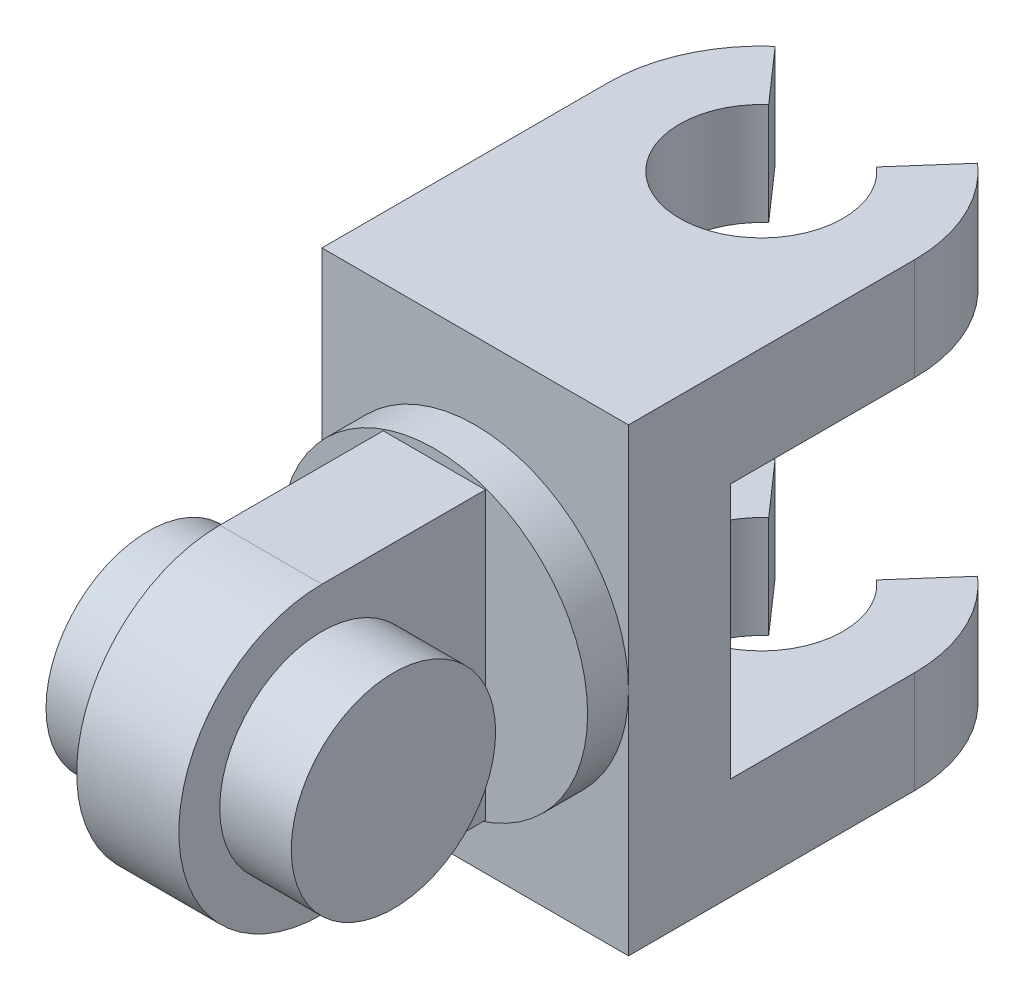
ISO-10303-21;
HEADER;
FILE_DESCRIPTION(('STEP AP214'),'2;1');
FILE_NAME('part.step','',(''),(''),'','','');
FILE_SCHEMA(('AUTOMOTIVE_DESIGN { 1 0 10303 214 1 1 1 1 }'));
ENDSEC;
DATA;
#1=APPLICATION_CONTEXT('core data for automotive mechanical design processes');
#2=APPLICATION_PROTOCOL_DEFINITION('international standard','automotive_design',2000,#1);
#3=PRODUCT_CONTEXT('',#1,'mechanical');
#4=PRODUCT('Part','Part','',(#3));
#5=PRODUCT_RELATED_PRODUCT_CATEGORY('part','',(#4));
#6=PRODUCT_DEFINITION_FORMATION('','',#4);
#7=PRODUCT_DEFINITION_CONTEXT('part definition',#1,'design');
#8=PRODUCT_DEFINITION('design','',#6,#7);
#9=PRODUCT_DEFINITION_SHAPE('','',#8);
#10=(LENGTH_UNIT() NAMED_UNIT(*) SI_UNIT(.MILLI.,.METRE.));
#11=(NAMED_UNIT(*) PLANE_ANGLE_UNIT() SI_UNIT($,.RADIAN.));
#12=(NAMED_UNIT(*) SI_UNIT($,.STERADIAN.) SOLID_ANGLE_UNIT());
#13=UNCERTAINTY_MEASURE_WITH_UNIT(LENGTH_MEASURE(1.E-05),#10,'distance_accuracy_value','');
#14=(GEOMETRIC_REPRESENTATION_CONTEXT(3) GLOBAL_UNCERTAINTY_ASSIGNED_CONTEXT((#13)) GLOBAL_UNIT_ASSIGNED_CONTEXT((#10,
#11,#12)) REPRESENTATION_CONTEXT('',''));
#15=CARTESIAN_POINT('',(0.,0.,0.));
#16=DIRECTION('',(0.,0.,1.));
#17=DIRECTION('',(1.,0.,0.));
#18=AXIS2_PLACEMENT_3D('',#15,#16,#17);
#19=CARTESIAN_POINT('',(0.,22.5,-48.));
#20=DIRECTION('',(0.,-1.,0.));
#21=DIRECTION('',(0.,0.,-1.));
#22=AXIS2_PLACEMENT_3D('',#19,#20,#21);
#23=CYLINDRICAL_SURFACE('',#22,15.);
#24=CARTESIAN_POINT('',(0.,12.5,-48.));
#25=DIRECTION('',(0.,1.,0.));
#26=DIRECTION('',(0.,0.,-1.));
#27=AXIS2_PLACEMENT_3D('',#24,#25,#26);
#28=CIRCLE('',#27,15.);
#29=CARTESIAN_POINT('',(15.,12.5,-48.));
#30=VERTEX_POINT('',#29);
#31=CARTESIAN_POINT('',(9.90919275071647,12.5,-59.2609013417731));
#32=VERTEX_POINT('',#31);
#33=EDGE_CURVE('E211',#30,#32,#28,.T.);
#34=ORIENTED_EDGE('',*,*,#33,.T.);
#35=DIRECTION('',(0.,1.,0.));
#36=VECTOR('',#35,1.);
#37=CARTESIAN_POINT('',(9.90919275071647,-44.2638182496902,-59.2609013417731));
#38=LINE('',#37,#36);
#39=CARTESIAN_POINT('',(9.90919275071647,22.5,-59.2609013417731));
#40=VERTEX_POINT('',#39);
#41=EDGE_CURVE('E402',#32,#40,#38,.T.);
#42=ORIENTED_EDGE('',*,*,#41,.T.);
#43=CARTESIAN_POINT('',(0.,22.5,-48.));
#44=DIRECTION('',(0.,1.,0.));
#45=DIRECTION('',(0.,0.,-1.));
#46=AXIS2_PLACEMENT_3D('',#43,#44,#45);
#47=CIRCLE('',#46,15.);
#48=CARTESIAN_POINT('',(15.,22.5,-48.));
#49=VERTEX_POINT('',#48);
#50=EDGE_CURVE('E207',#49,#40,#47,.T.);
#51=ORIENTED_EDGE('',*,*,#50,.F.);
#52=DIRECTION('',(0.,-1.,0.));
#53=VECTOR('',#52,1.);
#54=CARTESIAN_POINT('',(15.,22.5,-48.));
#55=LINE('',#54,#53);
#56=EDGE_CURVE('E226',#49,#30,#55,.T.);
#57=ORIENTED_EDGE('',*,*,#56,.T.);
#58=EDGE_LOOP('',(#34,#42,#51,#57));
#59=FACE_BOUND('',#58,.T.);
#60=ADVANCED_FACE('F41',(#59),#23,.T.);
#61=CARTESIAN_POINT('',(0.,-22.5,-48.));
#62=DIRECTION('',(0.,1.,0.));
#63=DIRECTION('',(0.,0.,1.));
#64=AXIS2_PLACEMENT_3D('',#61,#62,#63);
#65=CYLINDRICAL_SURFACE('',#64,15.);
#66=CARTESIAN_POINT('',(9.90919275071648,-22.5,-59.2609013417731));
#67=VERTEX_POINT('',#66);
#68=CARTESIAN_POINT('',(9.90919275071647,-12.5,-59.2609013417731));
#69=VERTEX_POINT('',#68);
#70=EDGE_CURVE('E393',#67,#69,#38,.T.);
#71=ORIENTED_EDGE('',*,*,#70,.T.);
#72=CARTESIAN_POINT('',(0.,-12.5,-48.));
#73=DIRECTION('',(0.,1.,0.));
#74=DIRECTION('',(0.,0.,-1.));
#75=AXIS2_PLACEMENT_3D('',#72,#73,#74);
#76=CIRCLE('',#75,15.);
#77=CARTESIAN_POINT('',(15.,-12.5,-48.));
#78=VERTEX_POINT('',#77);
#79=EDGE_CURVE('E430',#78,#69,#76,.T.);
#80=ORIENTED_EDGE('',*,*,#79,.F.);
#81=DIRECTION('',(0.,1.,0.));
#82=VECTOR('',#81,1.);
#83=CARTESIAN_POINT('',(15.,-22.5,-48.));
#84=LINE('',#83,#82);
#85=CARTESIAN_POINT('',(15.,-22.5,-48.));
#86=VERTEX_POINT('',#85);
#87=EDGE_CURVE('E413',#86,#78,#84,.T.);
#88=ORIENTED_EDGE('',*,*,#87,.F.);
#89=CARTESIAN_POINT('',(0.,-22.5,-48.));
#90=DIRECTION('',(0.,1.,0.));
#91=DIRECTION('',(0.,0.,-1.));
#92=AXIS2_PLACEMENT_3D('',#89,#90,#91);
#93=CIRCLE('',#92,15.);
#94=EDGE_CURVE('E406',#86,#67,#93,.T.);
#95=ORIENTED_EDGE('',*,*,#94,.T.);
#96=EDGE_LOOP('',(#71,#80,#88,#95));
#97=FACE_BOUND('',#96,.T.);
#98=ADVANCED_FACE('F337',(#97),#65,.T.);
#99=CARTESIAN_POINT('',(0.,0.,-30.));
#100=DIRECTION('',(0.,0.,-1.));
#101=DIRECTION('',(-1.,0.,0.));
#102=AXIS2_PLACEMENT_3D('',#99,#100,#101);
#103=PLANE('',#102);
#104=DIRECTION('',(0.,-1.,0.));
#105=VECTOR('',#104,1.);
#106=CARTESIAN_POINT('',(15.,22.5,-30.));
#107=LINE('',#106,#105);
#108=CARTESIAN_POINT('',(15.,12.5,-30.));
#109=VERTEX_POINT('',#108);
#110=CARTESIAN_POINT('',(15.,-12.5,-30.));
#111=VERTEX_POINT('',#110);
#112=EDGE_CURVE('E232',#109,#111,#107,.T.);
#113=ORIENTED_EDGE('',*,*,#112,.T.);
#114=DIRECTION('',(1.,0.,0.));
#115=VECTOR('',#114,1.);
#116=CARTESIAN_POINT('',(15.,-12.5,-30.));
#117=LINE('',#116,#115);
#118=CARTESIAN_POINT('',(-15.,-12.5,-30.));
#119=VERTEX_POINT('',#118);
#120=EDGE_CURVE('E423',#119,#111,#117,.T.);
#121=ORIENTED_EDGE('',*,*,#120,.F.);
#122=DIRECTION('',(0.,1.,0.));
#123=VECTOR('',#122,1.);
#124=CARTESIAN_POINT('',(-15.,22.5,-30.));
#125=LINE('',#124,#123);
#126=CARTESIAN_POINT('',(-15.,12.5,-30.));
#127=VERTEX_POINT('',#126);
#128=EDGE_CURVE('E230',#119,#127,#125,.T.);
#129=ORIENTED_EDGE('',*,*,#128,.T.);
#130=DIRECTION('',(1.,0.,0.));
#131=VECTOR('',#130,1.);
#132=CARTESIAN_POINT('',(15.,12.5,-30.));
#133=LINE('',#132,#131);
#134=EDGE_CURVE('E217',#127,#109,#133,.T.);
#135=ORIENTED_EDGE('',*,*,#134,.T.);
#136=EDGE_LOOP('',(#113,#121,#129,#135));
#137=FACE_BOUND('',#136,.T.);
#138=ADVANCED_FACE('F344',(#137),#103,.T.);
#139=CARTESIAN_POINT('',(12.,0.,0.));
#140=DIRECTION('',(-1.,0.,0.));
#141=DIRECTION('',(0.,0.,1.));
#142=AXIS2_PLACEMENT_3D('',#139,#140,#141);
#143=CYLINDRICAL_SURFACE('',#142,10.);
#144=CARTESIAN_POINT('',(12.,0.,0.));
#145=DIRECTION('',(1.,0.,0.));
#146=DIRECTION('',(0.,0.,-1.));
#147=AXIS2_PLACEMENT_3D('',#144,#145,#146);
#148=CIRCLE('',#147,10.);
#149=CARTESIAN_POINT('',(12.,0.,-10.));
#150=VERTEX_POINT('',#149);
#151=EDGE_CURVE('E49',#150,#150,#148,.T.);
#152=ORIENTED_EDGE('',*,*,#151,.F.);
#153=EDGE_LOOP('',(#152));
#154=FACE_BOUND('',#153,.T.);
#155=CARTESIAN_POINT('',(5.,0.,0.));
#156=DIRECTION('',(-1.,0.,0.));
#157=DIRECTION('',(0.,0.,1.));
#158=AXIS2_PLACEMENT_3D('',#155,#156,#157);
#159=CIRCLE('',#158,10.);
#160=CARTESIAN_POINT('',(5.,0.,10.));
#161=VERTEX_POINT('',#160);
#162=EDGE_CURVE('E11',#161,#161,#159,.T.);
#163=ORIENTED_EDGE('',*,*,#162,.F.);
#164=EDGE_LOOP('',(#163));
#165=FACE_BOUND('',#164,.T.);
#166=ADVANCED_FACE('F495',(#154,#165),#143,.T.);
#167=CARTESIAN_POINT('',(12.,0.,0.));
#168=DIRECTION('',(1.,0.,0.));
#169=DIRECTION('',(0.,0.,-1.));
#170=AXIS2_PLACEMENT_3D('',#167,#168,#169);
#171=PLANE('',#170);
#172=ORIENTED_EDGE('',*,*,#151,.T.);
#173=EDGE_LOOP('',(#172));
#174=FACE_BOUND('',#173,.T.);
#175=ADVANCED_FACE('F508',(#174),#171,.T.);
#176=CARTESIAN_POINT('',(5.,0.,0.));
#177=DIRECTION('',(-1.,0.,0.));
#178=DIRECTION('',(0.,0.,1.));
#179=AXIS2_PLACEMENT_3D('',#176,#177,#178);
#180=CYLINDRICAL_SURFACE('',#179,14.);
#181=CARTESIAN_POINT('',(-5.,0.,0.));
#182=DIRECTION('',(1.,0.,0.));
#183=DIRECTION('',(0.,0.,1.));
#184=AXIS2_PLACEMENT_3D('',#181,#182,#183);
#185=CIRCLE('',#184,14.);
#186=CARTESIAN_POINT('',(-5.,14.,0.));
#187=VERTEX_POINT('',#186);
#188=CARTESIAN_POINT('',(-5.,-14.,0.));
#189=VERTEX_POINT('',#188);
#190=EDGE_CURVE('E260',#187,#189,#185,.T.);
#191=ORIENTED_EDGE('',*,*,#190,.T.);
#192=DIRECTION('',(-1.,0.,0.));
#193=VECTOR('',#192,1.);
#194=CARTESIAN_POINT('',(5.,-14.,0.));
#195=LINE('',#194,#193);
#196=CARTESIAN_POINT('',(5.,-14.,0.));
#197=VERTEX_POINT('',#196);
#198=EDGE_CURVE('E291',#197,#189,#195,.T.);
#199=ORIENTED_EDGE('',*,*,#198,.F.);
#200=CARTESIAN_POINT('',(5.,0.,0.));
#201=DIRECTION('',(1.,0.,0.));
#202=DIRECTION('',(0.,0.,1.));
#203=AXIS2_PLACEMENT_3D('',#200,#201,#202);
#204=CIRCLE('',#203,14.);
#205=CARTESIAN_POINT('',(5.,14.,0.));
#206=VERTEX_POINT('',#205);
#207=EDGE_CURVE('E264',#206,#197,#204,.T.);
#208=ORIENTED_EDGE('',*,*,#207,.F.);
#209=DIRECTION('',(-1.,0.,0.));
#210=VECTOR('',#209,1.);
#211=CARTESIAN_POINT('',(5.,14.,0.));
#212=LINE('',#211,#210);
#213=EDGE_CURVE('E274',#206,#187,#212,.T.);
#214=ORIENTED_EDGE('',*,*,#213,.T.);
#215=EDGE_LOOP('',(#191,#199,#208,#214));
#216=FACE_BOUND('',#215,.T.);
#217=ADVANCED_FACE('F314',(#216),#180,.T.);
#218=CARTESIAN_POINT('',(5.,-14.,-16.));
#219=DIRECTION('',(0.,1.,0.));
#220=DIRECTION('',(0.,0.,1.));
#221=AXIS2_PLACEMENT_3D('',#218,#219,#220);
#222=PLANE('',#221);
#223=DIRECTION('',(0.,0.,-1.));
#224=VECTOR('',#223,1.);
#225=CARTESIAN_POINT('',(-5.,-14.,-16.));
#226=LINE('',#225,#224);
#227=CARTESIAN_POINT('',(-5.,-14.,-16.));
#228=VERTEX_POINT('',#227);
#229=EDGE_CURVE('E277',#189,#228,#226,.T.);
#230=ORIENTED_EDGE('',*,*,#229,.T.);
#231=DIRECTION('',(-1.,0.,0.));
#232=VECTOR('',#231,1.);
#233=CARTESIAN_POINT('',(5.,-14.,-16.));
#234=LINE('',#233,#232);
#235=CARTESIAN_POINT('',(5.,-14.,-16.));
#236=VERTEX_POINT('',#235);
#237=EDGE_CURVE('E288',#236,#228,#234,.T.);
#238=ORIENTED_EDGE('',*,*,#237,.F.);
#239=DIRECTION('',(0.,0.,-1.));
#240=VECTOR('',#239,1.);
#241=CARTESIAN_POINT('',(5.,-14.,-16.));
#242=LINE('',#241,#240);
#243=EDGE_CURVE('E267',#197,#236,#242,.T.);
#244=ORIENTED_EDGE('',*,*,#243,.F.);
#245=ORIENTED_EDGE('',*,*,#198,.T.);
#246=EDGE_LOOP('',(#230,#238,#244,#245));
#247=FACE_BOUND('',#246,.T.);
#248=ADVANCED_FACE('F326',(#247),#222,.F.);
#249=CARTESIAN_POINT('',(5.,14.,0.));
#250=DIRECTION('',(0.,-1.,0.));
#251=DIRECTION('',(0.,0.,-1.));
#252=AXIS2_PLACEMENT_3D('',#249,#250,#251);
#253=PLANE('',#252);
#254=DIRECTION('',(0.,0.,1.));
#255=VECTOR('',#254,1.);
#256=CARTESIAN_POINT('',(-5.,14.,0.));
#257=LINE('',#256,#255);
#258=CARTESIAN_POINT('',(-5.,14.,-16.));
#259=VERTEX_POINT('',#258);
#260=EDGE_CURVE('E268',#259,#187,#257,.T.);
#261=ORIENTED_EDGE('',*,*,#260,.T.);
#262=ORIENTED_EDGE('',*,*,#213,.F.);
#263=DIRECTION('',(0.,0.,1.));
#264=VECTOR('',#263,1.);
#265=CARTESIAN_POINT('',(5.,14.,0.));
#266=LINE('',#265,#264);
#267=CARTESIAN_POINT('',(5.,14.,-16.));
#268=VERTEX_POINT('',#267);
#269=EDGE_CURVE('E272',#268,#206,#266,.T.);
#270=ORIENTED_EDGE('',*,*,#269,.F.);
#271=DIRECTION('',(-1.,0.,0.));
#272=VECTOR('',#271,1.);
#273=CARTESIAN_POINT('',(5.,14.,-16.));
#274=LINE('',#273,#272);
#275=EDGE_CURVE('E286',#268,#259,#274,.T.);
#276=ORIENTED_EDGE('',*,*,#275,.T.);
#277=EDGE_LOOP('',(#261,#262,#270,#276));
#278=FACE_BOUND('',#277,.T.);
#279=ADVANCED_FACE('F319',(#278),#253,.F.);
#280=CARTESIAN_POINT('',(5.,0.,0.));
#281=DIRECTION('',(-1.,0.,0.));
#282=DIRECTION('',(0.,0.,1.));
#283=AXIS2_PLACEMENT_3D('',#280,#281,#282);
#284=PLANE('',#283);
#285=ORIENTED_EDGE('',*,*,#162,.T.);
#286=EDGE_LOOP('',(#285));
#287=FACE_BOUND('',#286,.T.);
#288=ORIENTED_EDGE('',*,*,#207,.T.);
#289=ORIENTED_EDGE('',*,*,#243,.T.);
#290=DIRECTION('',(0.,1.,0.));
#291=VECTOR('',#290,1.);
#292=CARTESIAN_POINT('',(5.,14.,-16.));
#293=LINE('',#292,#291);
#294=EDGE_CURVE('E270',#236,#268,#293,.T.);
#295=ORIENTED_EDGE('',*,*,#294,.T.);
#296=ORIENTED_EDGE('',*,*,#269,.T.);
#297=EDGE_LOOP('',(#288,#289,#295,#296));
#298=FACE_BOUND('',#297,.T.);
#299=ADVANCED_FACE('F308',(#287,#298),#284,.F.);
#300=CARTESIAN_POINT('',(-5.,0.,0.));
#301=DIRECTION('',(-1.,0.,0.));
#302=DIRECTION('',(0.,0.,1.));
#303=AXIS2_PLACEMENT_3D('',#300,#301,#302);
#304=PLANE('',#303);
#305=CARTESIAN_POINT('',(-5.,0.,0.));
#306=DIRECTION('',(-1.,0.,0.));
#307=DIRECTION('',(0.,0.,1.));
#308=AXIS2_PLACEMENT_3D('',#305,#306,#307);
#309=CIRCLE('',#308,10.);
#310=CARTESIAN_POINT('',(-5.,0.,10.));
#311=VERTEX_POINT('',#310);
#312=EDGE_CURVE('E294',#311,#311,#309,.T.);
#313=ORIENTED_EDGE('',*,*,#312,.F.);
#314=EDGE_LOOP('',(#313));
#315=FACE_BOUND('',#314,.T.);
#316=ORIENTED_EDGE('',*,*,#190,.F.);
#317=ORIENTED_EDGE('',*,*,#260,.F.);
#318=DIRECTION('',(0.,1.,0.));
#319=VECTOR('',#318,1.);
#320=CARTESIAN_POINT('',(-5.,14.,-16.));
#321=LINE('',#320,#319);
#322=EDGE_CURVE('E280',#228,#259,#321,.T.);
#323=ORIENTED_EDGE('',*,*,#322,.F.);
#324=ORIENTED_EDGE('',*,*,#229,.F.);
#325=EDGE_LOOP('',(#316,#317,#323,#324));
#326=FACE_BOUND('',#325,.T.);
#327=ADVANCED_FACE('F304',(#315,#326),#304,.T.);
#328=CARTESIAN_POINT('',(-12.,0.,0.));
#329=DIRECTION('',(1.,0.,0.));
#330=DIRECTION('',(0.,0.,-1.));
#331=AXIS2_PLACEMENT_3D('',#328,#329,#330);
#332=PLANE('',#331);
#333=CARTESIAN_POINT('',(-12.,0.,0.));
#334=DIRECTION('',(1.,0.,0.));
#335=DIRECTION('',(0.,0.,-1.));
#336=AXIS2_PLACEMENT_3D('',#333,#334,#335);
#337=CIRCLE('',#336,10.);
#338=CARTESIAN_POINT('',(-12.,0.,-10.));
#339=VERTEX_POINT('',#338);
#340=EDGE_CURVE('E297',#339,#339,#337,.T.);
#341=ORIENTED_EDGE('',*,*,#340,.F.);
#342=EDGE_LOOP('',(#341));
#343=FACE_BOUND('',#342,.T.);
#344=ADVANCED_FACE('F307',(#343),#332,.F.);
#345=ORIENTED_EDGE('',*,*,#312,.T.);
#346=EDGE_LOOP('',(#345));
#347=FACE_BOUND('',#346,.T.);
#348=ORIENTED_EDGE('',*,*,#340,.T.);
#349=EDGE_LOOP('',(#348));
#350=FACE_BOUND('',#349,.T.);
#351=ADVANCED_FACE('F43',(#347,#350),#143,.T.);
#352=CARTESIAN_POINT('',(0.,0.,-16.));
#353=DIRECTION('',(0.,0.,-1.));
#354=DIRECTION('',(-1.,0.,0.));
#355=AXIS2_PLACEMENT_3D('',#352,#353,#354);
#356=PLANE('',#355);
#357=CARTESIAN_POINT('',(0.,0.,-16.));
#358=DIRECTION('',(0.,0.,-1.));
#359=DIRECTION('',(-1.,0.,0.));
#360=AXIS2_PLACEMENT_3D('',#357,#358,#359);
#361=CIRCLE('',#360,15.);
#362=CARTESIAN_POINT('',(-15.,0.,-16.));
#363=VERTEX_POINT('',#362);
#364=EDGE_CURVE('E256',#363,#363,#361,.T.);
#365=ORIENTED_EDGE('',*,*,#364,.F.);
#366=EDGE_LOOP('',(#365));
#367=FACE_BOUND('',#366,.T.);
#368=ORIENTED_EDGE('',*,*,#237,.T.);
#369=ORIENTED_EDGE('',*,*,#322,.T.);
#370=ORIENTED_EDGE('',*,*,#275,.F.);
#371=ORIENTED_EDGE('',*,*,#294,.F.);
#372=EDGE_LOOP('',(#368,#369,#370,#371));
#373=FACE_BOUND('',#372,.T.);
#374=ADVANCED_FACE('F323',(#367,#373),#356,.F.);
#375=CARTESIAN_POINT('',(0.,0.,-20.));
#376=DIRECTION('',(0.,0.,1.));
#377=DIRECTION('',(1.,0.,0.));
#378=AXIS2_PLACEMENT_3D('',#375,#376,#377);
#379=CYLINDRICAL_SURFACE('',#378,15.);
#380=CARTESIAN_POINT('',(0.,0.,-20.));
#381=DIRECTION('',(0.,0.,-1.));
#382=DIRECTION('',(-1.,0.,0.));
#383=AXIS2_PLACEMENT_3D('',#380,#381,#382);
#384=CIRCLE('',#383,15.);
#385=CARTESIAN_POINT('',(-15.,0.,-20.));
#386=VERTEX_POINT('',#385);
#387=CARTESIAN_POINT('',(15.,0.,-20.));
#388=VERTEX_POINT('',#387);
#389=EDGE_CURVE('E257',#386,#388,#384,.T.);
#390=ORIENTED_EDGE('',*,*,#389,.F.);
#391=EDGE_CURVE('E261',#388,#386,#384,.T.);
#392=ORIENTED_EDGE('',*,*,#391,.F.);
#393=EDGE_LOOP('',(#390,#392));
#394=FACE_BOUND('',#393,.T.);
#395=ORIENTED_EDGE('',*,*,#364,.T.);
#396=EDGE_LOOP('',(#395));
#397=FACE_BOUND('',#396,.T.);
#398=ADVANCED_FACE('F485',(#394,#397),#379,.T.);
#399=CARTESIAN_POINT('',(0.,0.,-20.));
#400=DIRECTION('',(0.,0.,-1.));
#401=DIRECTION('',(-1.,0.,0.));
#402=AXIS2_PLACEMENT_3D('',#399,#400,#401);
#403=PLANE('',#402);
#404=DIRECTION('',(0.,1.,0.));
#405=VECTOR('',#404,1.);
#406=CARTESIAN_POINT('',(-15.,22.5,-20.));
#407=LINE('',#406,#405);
#408=CARTESIAN_POINT('',(-15.,22.5,-20.));
#409=VERTEX_POINT('',#408);
#410=EDGE_CURVE('E229',#386,#409,#407,.T.);
#411=ORIENTED_EDGE('',*,*,#410,.F.);
#412=ORIENTED_EDGE('',*,*,#389,.T.);
#413=DIRECTION('',(0.,-1.,0.));
#414=VECTOR('',#413,1.);
#415=CARTESIAN_POINT('',(15.,22.5,-20.));
#416=LINE('',#415,#414);
#417=CARTESIAN_POINT('',(15.,22.5,-20.));
#418=VERTEX_POINT('',#417);
#419=EDGE_CURVE('E242',#418,#388,#416,.T.);
#420=ORIENTED_EDGE('',*,*,#419,.F.);
#421=DIRECTION('',(1.,0.,0.));
#422=VECTOR('',#421,1.);
#423=CARTESIAN_POINT('',(15.,22.5,-20.));
#424=LINE('',#423,#422);
#425=EDGE_CURVE('E239',#409,#418,#424,.T.);
#426=ORIENTED_EDGE('',*,*,#425,.F.);
#427=EDGE_LOOP('',(#411,#412,#420,#426));
#428=FACE_BOUND('',#427,.T.);
#429=ADVANCED_FACE('F483',(#428),#403,.F.);
#430=CARTESIAN_POINT('',(15.,-22.5,-20.));
#431=VERTEX_POINT('',#430);
#432=EDGE_CURVE('E241',#388,#431,#416,.T.);
#433=ORIENTED_EDGE('',*,*,#432,.F.);
#434=ORIENTED_EDGE('',*,*,#391,.T.);
#435=CARTESIAN_POINT('',(-15.,-22.5,-20.));
#436=VERTEX_POINT('',#435);
#437=EDGE_CURVE('E236',#436,#386,#407,.T.);
#438=ORIENTED_EDGE('',*,*,#437,.F.);
#439=DIRECTION('',(-1.,0.,0.));
#440=VECTOR('',#439,1.);
#441=CARTESIAN_POINT('',(15.,-22.5,-20.));
#442=LINE('',#441,#440);
#443=EDGE_CURVE('E233',#431,#436,#442,.T.);
#444=ORIENTED_EDGE('',*,*,#443,.F.);
#445=EDGE_LOOP('',(#433,#434,#438,#444));
#446=FACE_BOUND('',#445,.T.);
#447=ADVANCED_FACE('F464',(#446),#403,.F.);
#448=CARTESIAN_POINT('',(-15.,22.5,-30.));
#449=DIRECTION('',(1.,0.,0.));
#450=DIRECTION('',(0.,1.,0.));
#451=AXIS2_PLACEMENT_3D('',#448,#449,#450);
#452=PLANE('',#451);
#453=ORIENTED_EDGE('',*,*,#437,.T.);
#454=ORIENTED_EDGE('',*,*,#410,.T.);
#455=DIRECTION('',(0.,0.,1.));
#456=VECTOR('',#455,1.);
#457=CARTESIAN_POINT('',(-15.,22.5,-30.));
#458=LINE('',#457,#456);
#459=CARTESIAN_POINT('',(-15.,22.5,-48.));
#460=VERTEX_POINT('',#459);
#461=EDGE_CURVE('E254',#460,#409,#458,.T.);
#462=ORIENTED_EDGE('',*,*,#461,.F.);
#463=DIRECTION('',(0.,-1.,0.));
#464=VECTOR('',#463,1.);
#465=CARTESIAN_POINT('',(-15.,22.5,-48.));
#466=LINE('',#465,#464);
#467=CARTESIAN_POINT('',(-15.,12.5,-48.));
#468=VERTEX_POINT('',#467);
#469=EDGE_CURVE('E206',#460,#468,#466,.T.);
#470=ORIENTED_EDGE('',*,*,#469,.T.);
#471=DIRECTION('',(0.,0.,1.));
#472=VECTOR('',#471,1.);
#473=CARTESIAN_POINT('',(-15.,12.5,-30.));
#474=LINE('',#473,#472);
#475=EDGE_CURVE('E208',#468,#127,#474,.T.);
#476=ORIENTED_EDGE('',*,*,#475,.T.);
#477=ORIENTED_EDGE('',*,*,#128,.F.);
#478=DIRECTION('',(0.,0.,1.));
#479=VECTOR('',#478,1.);
#480=CARTESIAN_POINT('',(-15.,-12.5,-30.));
#481=LINE('',#480,#479);
#482=CARTESIAN_POINT('',(-15.,-12.5,-48.));
#483=VERTEX_POINT('',#482);
#484=EDGE_CURVE('E418',#483,#119,#481,.T.);
#485=ORIENTED_EDGE('',*,*,#484,.F.);
#486=DIRECTION('',(0.,1.,0.));
#487=VECTOR('',#486,1.);
#488=CARTESIAN_POINT('',(-15.,-22.5,-48.));
#489=LINE('',#488,#487);
#490=CARTESIAN_POINT('',(-15.,-22.5,-48.));
#491=VERTEX_POINT('',#490);
#492=EDGE_CURVE('E416',#491,#483,#489,.T.);
#493=ORIENTED_EDGE('',*,*,#492,.F.);
#494=DIRECTION('',(0.,0.,1.));
#495=VECTOR('',#494,1.);
#496=CARTESIAN_POINT('',(-15.,-22.5,-30.));
#497=LINE('',#496,#495);
#498=EDGE_CURVE('E235',#491,#436,#497,.T.);
#499=ORIENTED_EDGE('',*,*,#498,.T.);
#500=EDGE_LOOP('',(#453,#454,#462,#470,#476,#477,#485,#493,#499));
#501=FACE_BOUND('',#500,.T.);
#502=ADVANCED_FACE('F468',(#501),#452,.F.);
#503=CARTESIAN_POINT('',(15.,22.5,-30.));
#504=DIRECTION('',(0.,-1.,0.));
#505=DIRECTION('',(0.,0.,-1.));
#506=AXIS2_PLACEMENT_3D('',#503,#504,#505);
#507=PLANE('',#506);
#508=ORIENTED_EDGE('',*,*,#50,.T.);
#509=DIRECTION('',(0.660612850047765,0.,-0.750726756118209));
#510=VECTOR('',#509,1.);
#511=CARTESIAN_POINT('',(9.90919275071647,22.5,-59.2609013417731));
#512=LINE('',#511,#510);
#513=CARTESIAN_POINT('',(5.28490280038212,22.5,-54.0058140489457));
#514=VERTEX_POINT('',#513);
#515=EDGE_CURVE('E190',#514,#40,#512,.T.);
#516=ORIENTED_EDGE('',*,*,#515,.F.);
#517=CARTESIAN_POINT('',(0.,22.5,-48.));
#518=DIRECTION('',(0.,1.,0.));
#519=DIRECTION('',(0.,0.,1.));
#520=AXIS2_PLACEMENT_3D('',#517,#518,#519);
#521=CIRCLE('',#520,8.);
#522=CARTESIAN_POINT('',(-5.28490280038211,22.5,-54.0058140489457));
#523=VERTEX_POINT('',#522);
#524=EDGE_CURVE('E201',#523,#514,#521,.T.);
#525=ORIENTED_EDGE('',*,*,#524,.F.);
#526=DIRECTION('',(0.660612850047765,0.,0.750726756118209));
#527=VECTOR('',#526,1.);
#528=CARTESIAN_POINT('',(-9.90919275071646,22.5,-59.2609013417731));
#529=LINE('',#528,#527);
#530=CARTESIAN_POINT('',(-9.90919275071646,22.5,-59.2609013417731));
#531=VERTEX_POINT('',#530);
#532=EDGE_CURVE('E64',#531,#523,#529,.T.);
#533=ORIENTED_EDGE('',*,*,#532,.F.);
#534=EDGE_CURVE('E197',#531,#460,#47,.T.);
#535=ORIENTED_EDGE('',*,*,#534,.T.);
#536=ORIENTED_EDGE('',*,*,#461,.T.);
#537=ORIENTED_EDGE('',*,*,#425,.T.);
#538=DIRECTION('',(0.,0.,1.));
#539=VECTOR('',#538,1.);
#540=CARTESIAN_POINT('',(15.,22.5,-30.));
#541=LINE('',#540,#539);
#542=EDGE_CURVE('E251',#49,#418,#541,.T.);
#543=ORIENTED_EDGE('',*,*,#542,.F.);
#544=EDGE_LOOP('',(#508,#516,#525,#533,#535,#536,#537,#543));
#545=FACE_BOUND('',#544,.T.);
#546=ADVANCED_FACE('F195',(#545),#507,.F.);
#547=CARTESIAN_POINT('',(15.,22.5,-30.));
#548=DIRECTION('',(-1.,0.,0.));
#549=DIRECTION('',(0.,-1.,0.));
#550=AXIS2_PLACEMENT_3D('',#547,#548,#549);
#551=PLANE('',#550);
#552=ORIENTED_EDGE('',*,*,#419,.T.);
#553=ORIENTED_EDGE('',*,*,#432,.T.);
#554=DIRECTION('',(0.,0.,1.));
#555=VECTOR('',#554,1.);
#556=CARTESIAN_POINT('',(15.,-22.5,-30.));
#557=LINE('',#556,#555);
#558=EDGE_CURVE('E248',#86,#431,#557,.T.);
#559=ORIENTED_EDGE('',*,*,#558,.F.);
#560=ORIENTED_EDGE('',*,*,#87,.T.);
#561=DIRECTION('',(0.,0.,-1.));
#562=VECTOR('',#561,1.);
#563=CARTESIAN_POINT('',(15.,-12.5,-48.));
#564=LINE('',#563,#562);
#565=EDGE_CURVE('E426',#111,#78,#564,.T.);
#566=ORIENTED_EDGE('',*,*,#565,.F.);
#567=ORIENTED_EDGE('',*,*,#112,.F.);
#568=DIRECTION('',(0.,0.,-1.));
#569=VECTOR('',#568,1.);
#570=CARTESIAN_POINT('',(15.,12.5,-48.));
#571=LINE('',#570,#569);
#572=EDGE_CURVE('E220',#109,#30,#571,.T.);
#573=ORIENTED_EDGE('',*,*,#572,.T.);
#574=ORIENTED_EDGE('',*,*,#56,.F.);
#575=ORIENTED_EDGE('',*,*,#542,.T.);
#576=EDGE_LOOP('',(#552,#553,#559,#560,#566,#567,#573,#574,#575));
#577=FACE_BOUND('',#576,.T.);
#578=ADVANCED_FACE('F364',(#577),#551,.F.);
#579=CARTESIAN_POINT('',(15.,-22.5,-30.));
#580=DIRECTION('',(0.,1.,0.));
#581=DIRECTION('',(0.,0.,1.));
#582=AXIS2_PLACEMENT_3D('',#579,#580,#581);
#583=PLANE('',#582);
#584=CARTESIAN_POINT('',(0.,-22.5,-48.));
#585=DIRECTION('',(0.,1.,0.));
#586=DIRECTION('',(0.,0.,1.));
#587=AXIS2_PLACEMENT_3D('',#584,#585,#586);
#588=CIRCLE('',#587,8.);
#589=CARTESIAN_POINT('',(-5.28490280038212,-22.5,-54.0058140489457));
#590=VERTEX_POINT('',#589);
#591=CARTESIAN_POINT('',(5.28490280038212,-22.5,-54.0058140489457));
#592=VERTEX_POINT('',#591);
#593=EDGE_CURVE('E409',#590,#592,#588,.T.);
#594=ORIENTED_EDGE('',*,*,#593,.T.);
#595=DIRECTION('',(-0.660612850047765,0.,0.750726756118209));
#596=VECTOR('',#595,1.);
#597=CARTESIAN_POINT('',(9.90919275071647,-22.5,-59.2609013417731));
#598=LINE('',#597,#596);
#599=EDGE_CURVE('E395',#67,#592,#598,.T.);
#600=ORIENTED_EDGE('',*,*,#599,.F.);
#601=ORIENTED_EDGE('',*,*,#94,.F.);
#602=ORIENTED_EDGE('',*,*,#558,.T.);
#603=ORIENTED_EDGE('',*,*,#443,.T.);
#604=ORIENTED_EDGE('',*,*,#498,.F.);
#605=CARTESIAN_POINT('',(-9.90919275071647,-22.5,-59.2609013417731));
#606=VERTEX_POINT('',#605);
#607=EDGE_CURVE('E414',#606,#491,#93,.T.);
#608=ORIENTED_EDGE('',*,*,#607,.F.);
#609=DIRECTION('',(-0.660612850047765,0.,-0.75072675611821));
#610=VECTOR('',#609,1.);
#611=CARTESIAN_POINT('',(-9.90919275071646,-22.5,-59.2609013417731));
#612=LINE('',#611,#610);
#613=EDGE_CURVE('E410',#590,#606,#612,.T.);
#614=ORIENTED_EDGE('',*,*,#613,.F.);
#615=EDGE_LOOP('',(#594,#600,#601,#602,#603,#604,#608,#614));
#616=FACE_BOUND('',#615,.T.);
#617=ADVANCED_FACE('F359',(#616),#583,.F.);
#618=CARTESIAN_POINT('',(0.,12.5,-48.));
#619=DIRECTION('',(0.,-1.,0.));
#620=DIRECTION('',(0.,0.,-1.));
#621=AXIS2_PLACEMENT_3D('',#618,#619,#620);
#622=PLANE('',#621);
#623=DIRECTION('',(-0.660612850047765,0.,0.750726756118209));
#624=VECTOR('',#623,1.);
#625=CARTESIAN_POINT('',(0.,12.5,-48.));
#626=LINE('',#625,#624);
#627=CARTESIAN_POINT('',(5.28490280038212,12.5,-54.0058140489457));
#628=VERTEX_POINT('',#627);
#629=EDGE_CURVE('E56',#32,#628,#626,.T.);
#630=ORIENTED_EDGE('',*,*,#629,.F.);
#631=ORIENTED_EDGE('',*,*,#33,.F.);
#632=ORIENTED_EDGE('',*,*,#572,.F.);
#633=ORIENTED_EDGE('',*,*,#134,.F.);
#634=ORIENTED_EDGE('',*,*,#475,.F.);
#635=CARTESIAN_POINT('',(-9.90919275071646,12.5,-59.2609013417731));
#636=VERTEX_POINT('',#635);
#637=EDGE_CURVE('E222',#636,#468,#28,.T.);
#638=ORIENTED_EDGE('',*,*,#637,.F.);
#639=DIRECTION('',(-0.660612850047765,0.,-0.75072675611821));
#640=VECTOR('',#639,1.);
#641=CARTESIAN_POINT('',(0.,12.5,-48.));
#642=LINE('',#641,#640);
#643=CARTESIAN_POINT('',(-5.28490280038212,12.5,-54.0058140489457));
#644=VERTEX_POINT('',#643);
#645=EDGE_CURVE('E185',#644,#636,#642,.T.);
#646=ORIENTED_EDGE('',*,*,#645,.F.);
#647=CARTESIAN_POINT('',(0.,12.5,-48.));
#648=DIRECTION('',(0.,1.,0.));
#649=DIRECTION('',(0.,0.,1.));
#650=AXIS2_PLACEMENT_3D('',#647,#648,#649);
#651=CIRCLE('',#650,8.);
#652=EDGE_CURVE('E215',#644,#628,#651,.T.);
#653=ORIENTED_EDGE('',*,*,#652,.T.);
#654=EDGE_LOOP('',(#630,#631,#632,#633,#634,#638,#646,#653));
#655=FACE_BOUND('',#654,.T.);
#656=ADVANCED_FACE('F352',(#655),#622,.T.);
#657=ORIENTED_EDGE('',*,*,#534,.F.);
#658=DIRECTION('',(0.,1.,0.));
#659=VECTOR('',#658,1.);
#660=CARTESIAN_POINT('',(-9.90919275071646,-44.2638182496902,-59.2609013417731));
#661=LINE('',#660,#659);
#662=EDGE_CURVE('E182',#636,#531,#661,.T.);
#663=ORIENTED_EDGE('',*,*,#662,.F.);
#664=ORIENTED_EDGE('',*,*,#637,.T.);
#665=ORIENTED_EDGE('',*,*,#469,.F.);
#666=EDGE_LOOP('',(#657,#663,#664,#665));
#667=FACE_BOUND('',#666,.T.);
#668=ADVANCED_FACE('F204',(#667),#23,.T.);
#669=CARTESIAN_POINT('',(0.,22.5,-48.));
#670=DIRECTION('',(0.,-1.,0.));
#671=DIRECTION('',(0.,0.,-1.));
#672=AXIS2_PLACEMENT_3D('',#669,#670,#671);
#673=CYLINDRICAL_SURFACE('',#672,8.);
#674=DIRECTION('',(0.,1.,0.));
#675=VECTOR('',#674,1.);
#676=CARTESIAN_POINT('',(5.28490280038212,-44.2638182496902,-54.0058140489457));
#677=LINE('',#676,#675);
#678=EDGE_CURVE('E439',#628,#514,#677,.T.);
#679=ORIENTED_EDGE('',*,*,#678,.F.);
#680=ORIENTED_EDGE('',*,*,#652,.F.);
#681=DIRECTION('',(0.,1.,0.));
#682=VECTOR('',#681,1.);
#683=CARTESIAN_POINT('',(-5.28490280038212,-44.2638182496902,-54.0058140489457));
#684=LINE('',#683,#682);
#685=EDGE_CURVE('E438',#644,#523,#684,.T.);
#686=ORIENTED_EDGE('',*,*,#685,.T.);
#687=ORIENTED_EDGE('',*,*,#524,.T.);
#688=EDGE_LOOP('',(#679,#680,#686,#687));
#689=FACE_BOUND('',#688,.T.);
#690=ADVANCED_FACE('F351',(#689),#673,.F.);
#691=CARTESIAN_POINT('',(-9.90919275071646,-12.5,-59.2609013417731));
#692=VERTEX_POINT('',#691);
#693=EDGE_CURVE('E189',#606,#692,#661,.T.);
#694=ORIENTED_EDGE('',*,*,#693,.F.);
#695=ORIENTED_EDGE('',*,*,#607,.T.);
#696=ORIENTED_EDGE('',*,*,#492,.T.);
#697=EDGE_CURVE('E429',#692,#483,#76,.T.);
#698=ORIENTED_EDGE('',*,*,#697,.F.);
#699=EDGE_LOOP('',(#694,#695,#696,#698));
#700=FACE_BOUND('',#699,.T.);
#701=ADVANCED_FACE('F347',(#700),#65,.T.);
#702=CARTESIAN_POINT('',(0.,-12.5,-48.));
#703=DIRECTION('',(0.,-1.,0.));
#704=DIRECTION('',(0.,0.,-1.));
#705=AXIS2_PLACEMENT_3D('',#702,#703,#704);
#706=PLANE('',#705);
#707=ORIENTED_EDGE('',*,*,#79,.T.);
#708=DIRECTION('',(-0.660612850047765,0.,0.750726756118209));
#709=VECTOR('',#708,1.);
#710=CARTESIAN_POINT('',(0.,-12.5,-48.));
#711=LINE('',#710,#709);
#712=CARTESIAN_POINT('',(5.28490280038212,-12.5,-54.0058140489457));
#713=VERTEX_POINT('',#712);
#714=EDGE_CURVE('E398',#69,#713,#711,.T.);
#715=ORIENTED_EDGE('',*,*,#714,.T.);
#716=CARTESIAN_POINT('',(0.,-12.5,-48.));
#717=DIRECTION('',(0.,1.,0.));
#718=DIRECTION('',(0.,0.,1.));
#719=AXIS2_PLACEMENT_3D('',#716,#717,#718);
#720=CIRCLE('',#719,8.);
#721=CARTESIAN_POINT('',(-5.28490280038211,-12.5,-54.0058140489457));
#722=VERTEX_POINT('',#721);
#723=EDGE_CURVE('E421',#722,#713,#720,.T.);
#724=ORIENTED_EDGE('',*,*,#723,.F.);
#725=DIRECTION('',(-0.660612850047765,0.,-0.75072675611821));
#726=VECTOR('',#725,1.);
#727=CARTESIAN_POINT('',(0.,-12.5,-48.));
#728=LINE('',#727,#726);
#729=EDGE_CURVE('E448',#722,#692,#728,.T.);
#730=ORIENTED_EDGE('',*,*,#729,.T.);
#731=ORIENTED_EDGE('',*,*,#697,.T.);
#732=ORIENTED_EDGE('',*,*,#484,.T.);
#733=ORIENTED_EDGE('',*,*,#120,.T.);
#734=ORIENTED_EDGE('',*,*,#565,.T.);
#735=EDGE_LOOP('',(#707,#715,#724,#730,#731,#732,#733,#734));
#736=FACE_BOUND('',#735,.T.);
#737=ADVANCED_FACE('F369',(#736),#706,.F.);
#738=CARTESIAN_POINT('',(0.,-22.5,-48.));
#739=DIRECTION('',(0.,1.,0.));
#740=DIRECTION('',(0.,0.,1.));
#741=AXIS2_PLACEMENT_3D('',#738,#739,#740);
#742=CYLINDRICAL_SURFACE('',#741,8.);
#743=ORIENTED_EDGE('',*,*,#723,.T.);
#744=EDGE_CURVE('E440',#592,#713,#677,.T.);
#745=ORIENTED_EDGE('',*,*,#744,.F.);
#746=ORIENTED_EDGE('',*,*,#593,.F.);
#747=EDGE_CURVE('E441',#590,#722,#684,.T.);
#748=ORIENTED_EDGE('',*,*,#747,.T.);
#749=EDGE_LOOP('',(#743,#745,#746,#748));
#750=FACE_BOUND('',#749,.T.);
#751=ADVANCED_FACE('F373',(#750),#742,.F.);
#752=CARTESIAN_POINT('',(-9.90919275071646,-44.2638182496902,-59.2609013417731));
#753=DIRECTION('',(-0.750726756118209,0.,0.660612850047765));
#754=DIRECTION('',(0.660612850047765,0.,0.75072675611821));
#755=AXIS2_PLACEMENT_3D('',#752,#753,#754);
#756=PLANE('',#755);
#757=ORIENTED_EDGE('',*,*,#747,.F.);
#758=ORIENTED_EDGE('',*,*,#613,.T.);
#759=ORIENTED_EDGE('',*,*,#693,.T.);
#760=ORIENTED_EDGE('',*,*,#729,.F.);
#761=EDGE_LOOP('',(#757,#758,#759,#760));
#762=FACE_BOUND('',#761,.T.);
#763=ADVANCED_FACE('F377',(#762),#756,.F.);
#764=CARTESIAN_POINT('',(9.90919275071647,-44.2638182496902,-59.2609013417731));
#765=DIRECTION('',(0.750726756118209,0.,0.660612850047765));
#766=DIRECTION('',(0.660612850047765,0.,-0.750726756118209));
#767=AXIS2_PLACEMENT_3D('',#764,#765,#766);
#768=PLANE('',#767);
#769=ORIENTED_EDGE('',*,*,#70,.F.);
#770=ORIENTED_EDGE('',*,*,#599,.T.);
#771=ORIENTED_EDGE('',*,*,#744,.T.);
#772=ORIENTED_EDGE('',*,*,#714,.F.);
#773=EDGE_LOOP('',(#769,#770,#771,#772));
#774=FACE_BOUND('',#773,.T.);
#775=ADVANCED_FACE('F382',(#774),#768,.F.);
#776=ORIENTED_EDGE('',*,*,#645,.T.);
#777=ORIENTED_EDGE('',*,*,#662,.T.);
#778=ORIENTED_EDGE('',*,*,#532,.T.);
#779=ORIENTED_EDGE('',*,*,#685,.F.);
#780=EDGE_LOOP('',(#776,#777,#778,#779));
#781=FACE_BOUND('',#780,.T.);
#782=ADVANCED_FACE('F183',(#781),#756,.F.);
#783=ORIENTED_EDGE('',*,*,#629,.T.);
#784=ORIENTED_EDGE('',*,*,#678,.T.);
#785=ORIENTED_EDGE('',*,*,#515,.T.);
#786=ORIENTED_EDGE('',*,*,#41,.F.);
#787=EDGE_LOOP('',(#783,#784,#785,#786));
#788=FACE_BOUND('',#787,.T.);
#789=ADVANCED_FACE('F381',(#788),#768,.F.);
#790=CLOSED_SHELL('',(#60,#98,#138,#166,#175,#217,#248,#279,#299,#327,#344,#351,#374,#398,#429,
#447,#502,#546,#578,#617,#656,#668,#690,#701,#737,#751,#763,#775,#782,#789));
#791=MANIFOLD_SOLID_BREP('B2',#790);
#792=ADVANCED_BREP_SHAPE_REPRESENTATION('',(#18,#791),#14);
#793=SHAPE_DEFINITION_REPRESENTATION(#9,#792);
ENDSEC;
END-ISO-10303-21;
